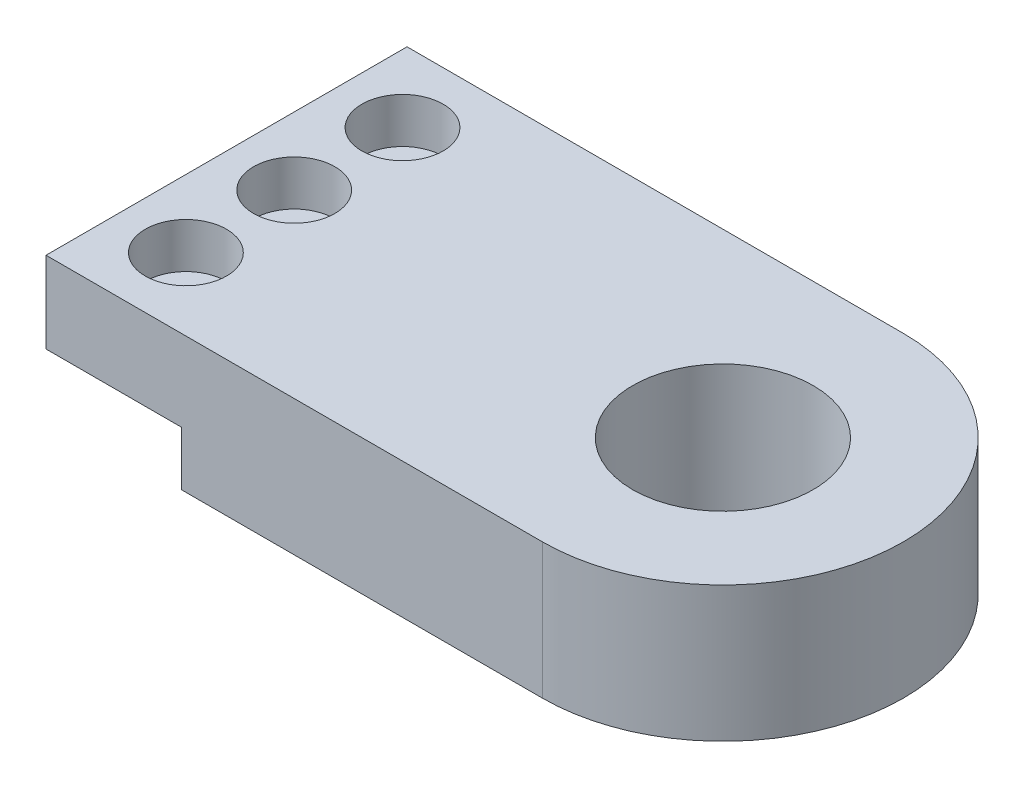
ISO-10303-21;
HEADER;
FILE_DESCRIPTION(('STEP AP214'),'2;1');
FILE_NAME('part.step','',(''),(''),'','','');
FILE_SCHEMA(('AUTOMOTIVE_DESIGN { 1 0 10303 214 1 1 1 1 }'));
ENDSEC;
DATA;
#1=APPLICATION_CONTEXT('core data for automotive mechanical design processes');
#2=APPLICATION_PROTOCOL_DEFINITION('international standard','automotive_design',2000,#1);
#3=PRODUCT_CONTEXT('',#1,'mechanical');
#4=PRODUCT('Part','Part','',(#3));
#5=PRODUCT_RELATED_PRODUCT_CATEGORY('part','',(#4));
#6=PRODUCT_DEFINITION_FORMATION('','',#4);
#7=PRODUCT_DEFINITION_CONTEXT('part definition',#1,'design');
#8=PRODUCT_DEFINITION('design','',#6,#7);
#9=PRODUCT_DEFINITION_SHAPE('','',#8);
#10=(LENGTH_UNIT() NAMED_UNIT(*) SI_UNIT(.MILLI.,.METRE.));
#11=(NAMED_UNIT(*) PLANE_ANGLE_UNIT() SI_UNIT($,.RADIAN.));
#12=(NAMED_UNIT(*) SI_UNIT($,.STERADIAN.) SOLID_ANGLE_UNIT());
#13=UNCERTAINTY_MEASURE_WITH_UNIT(LENGTH_MEASURE(1.E-05),#10,'distance_accuracy_value','');
#14=(GEOMETRIC_REPRESENTATION_CONTEXT(3) GLOBAL_UNCERTAINTY_ASSIGNED_CONTEXT((#13)) GLOBAL_UNIT_ASSIGNED_CONTEXT((#10,
#11,#12)) REPRESENTATION_CONTEXT('',''));
#15=CARTESIAN_POINT('',(0.,0.,0.));
#16=DIRECTION('',(0.,0.,1.));
#17=DIRECTION('',(1.,0.,0.));
#18=AXIS2_PLACEMENT_3D('',#15,#16,#17);
#19=CARTESIAN_POINT('',(-47.4999999999997,-0.000999999999999265,12.));
#20=DIRECTION('',(0.,1.,0.));
#21=DIRECTION('',(0.,0.,1.));
#22=AXIS2_PLACEMENT_3D('',#19,#20,#21);
#23=CYLINDRICAL_SURFACE('',#22,2.5);
#24=CARTESIAN_POINT('',(-47.4999999999997,6.,12.));
#25=DIRECTION('',(0.,-1.,0.));
#26=DIRECTION('',(1.,0.,0.));
#27=AXIS2_PLACEMENT_3D('',#24,#25,#26);
#28=CIRCLE('',#27,2.5);
#29=CARTESIAN_POINT('',(-47.4999999999997,6.,14.5));
#30=VERTEX_POINT('',#29);
#31=EDGE_CURVE('E140',#30,#30,#28,.F.);
#32=CARTESIAN_POINT('',(-47.4999999999997,10.,12.));
#33=DIRECTION('',(0.,1.,0.));
#34=DIRECTION('',(0.,0.,1.));
#35=AXIS2_PLACEMENT_3D('',#32,#33,#34);
#36=CIRCLE('',#35,2.5);
#37=CARTESIAN_POINT('',(-47.4999999999997,10.,14.5));
#38=VERTEX_POINT('',#37);
#39=EDGE_CURVE('E162',#38,#38,#36,.T.);
#40=CARTESIAN_POINT('',(-47.4999999999997,6.,14.5));
#41=CARTESIAN_POINT('',(-47.4999999999997,6.04166666666666,14.5));
#42=CARTESIAN_POINT('',(-47.4999999999997,6.08333333333333,14.5));
#43=CARTESIAN_POINT('',(-47.4999999999997,6.16666666666666,14.5));
#44=CARTESIAN_POINT('',(-47.4999999999997,6.20833333333333,14.5));
#45=CARTESIAN_POINT('',(-47.4999999999997,6.29166666666666,14.5));
#46=CARTESIAN_POINT('',(-47.4999999999997,6.33333333333333,14.5));
#47=CARTESIAN_POINT('',(-47.4999999999997,6.41666666666666,14.5));
#48=CARTESIAN_POINT('',(-47.4999999999997,6.45833333333333,14.5));
#49=CARTESIAN_POINT('',(-47.4999999999997,6.54166666666666,14.5));
#50=CARTESIAN_POINT('',(-47.4999999999997,6.58333333333333,14.5));
#51=CARTESIAN_POINT('',(-47.4999999999997,6.66666666666666,14.5));
#52=CARTESIAN_POINT('',(-47.4999999999997,6.70833333333333,14.5));
#53=CARTESIAN_POINT('',(-47.4999999999997,6.79166666666666,14.5));
#54=CARTESIAN_POINT('',(-47.4999999999997,6.83333333333333,14.5));
#55=CARTESIAN_POINT('',(-47.4999999999997,6.91666666666666,14.5));
#56=CARTESIAN_POINT('',(-47.4999999999997,6.95833333333333,14.5));
#57=CARTESIAN_POINT('',(-47.4999999999997,7.04166666666667,14.5));
#58=CARTESIAN_POINT('',(-47.4999999999997,7.08333333333333,14.5));
#59=CARTESIAN_POINT('',(-47.4999999999997,7.16666666666667,14.5));
#60=CARTESIAN_POINT('',(-47.4999999999997,7.20833333333333,14.5));
#61=CARTESIAN_POINT('',(-47.4999999999997,7.29166666666667,14.5));
#62=CARTESIAN_POINT('',(-47.4999999999997,7.33333333333333,14.5));
#63=CARTESIAN_POINT('',(-47.4999999999997,7.41666666666666,14.5));
#64=CARTESIAN_POINT('',(-47.4999999999997,7.45833333333333,14.5));
#65=CARTESIAN_POINT('',(-47.4999999999997,7.54166666666666,14.5));
#66=CARTESIAN_POINT('',(-47.4999999999997,7.58333333333333,14.5));
#67=CARTESIAN_POINT('',(-47.4999999999997,7.66666666666666,14.5));
#68=CARTESIAN_POINT('',(-47.4999999999997,7.70833333333333,14.5));
#69=CARTESIAN_POINT('',(-47.4999999999997,7.79166666666666,14.5));
#70=CARTESIAN_POINT('',(-47.4999999999997,7.83333333333333,14.5));
#71=CARTESIAN_POINT('',(-47.4999999999997,7.91666666666666,14.5));
#72=CARTESIAN_POINT('',(-47.4999999999997,7.95833333333333,14.5));
#73=CARTESIAN_POINT('',(-47.4999999999997,8.04166666666666,14.5));
#74=CARTESIAN_POINT('',(-47.4999999999997,8.08333333333333,14.5));
#75=CARTESIAN_POINT('',(-47.4999999999997,8.16666666666666,14.5));
#76=CARTESIAN_POINT('',(-47.4999999999997,8.20833333333333,14.5));
#77=CARTESIAN_POINT('',(-47.4999999999997,8.29166666666666,14.5));
#78=CARTESIAN_POINT('',(-47.4999999999997,8.33333333333333,14.5));
#79=CARTESIAN_POINT('',(-47.4999999999997,8.41666666666666,14.5));
#80=CARTESIAN_POINT('',(-47.4999999999997,8.45833333333333,14.5));
#81=CARTESIAN_POINT('',(-47.4999999999997,8.54166666666666,14.5));
#82=CARTESIAN_POINT('',(-47.4999999999997,8.58333333333333,14.5));
#83=CARTESIAN_POINT('',(-47.4999999999997,8.66666666666666,14.5));
#84=CARTESIAN_POINT('',(-47.4999999999997,8.70833333333333,14.5));
#85=CARTESIAN_POINT('',(-47.4999999999997,8.79166666666666,14.5));
#86=CARTESIAN_POINT('',(-47.4999999999997,8.83333333333333,14.5));
#87=CARTESIAN_POINT('',(-47.4999999999997,8.91666666666666,14.5));
#88=CARTESIAN_POINT('',(-47.4999999999997,8.95833333333333,14.5));
#89=CARTESIAN_POINT('',(-47.4999999999997,9.04166666666666,14.5));
#90=CARTESIAN_POINT('',(-47.4999999999997,9.08333333333333,14.5));
#91=CARTESIAN_POINT('',(-47.4999999999997,9.16666666666666,14.5));
#92=CARTESIAN_POINT('',(-47.4999999999997,9.20833333333333,14.5));
#93=CARTESIAN_POINT('',(-47.4999999999997,9.29166666666666,14.5));
#94=CARTESIAN_POINT('',(-47.4999999999997,9.33333333333333,14.5));
#95=CARTESIAN_POINT('',(-47.4999999999997,9.41666666666667,14.5));
#96=CARTESIAN_POINT('',(-47.4999999999997,9.45833333333333,14.5));
#97=CARTESIAN_POINT('',(-47.4999999999997,9.54166666666667,14.5));
#98=CARTESIAN_POINT('',(-47.4999999999997,9.58333333333333,14.5));
#99=CARTESIAN_POINT('',(-47.4999999999997,9.66666666666667,14.5));
#100=CARTESIAN_POINT('',(-47.4999999999997,9.70833333333333,14.5));
#101=CARTESIAN_POINT('',(-47.4999999999997,9.79166666666667,14.5));
#102=CARTESIAN_POINT('',(-47.4999999999997,9.83333333333333,14.5));
#103=CARTESIAN_POINT('',(-47.4999999999997,9.91666666666667,14.5));
#104=CARTESIAN_POINT('',(-47.4999999999997,9.95833333333333,14.5));
#105=CARTESIAN_POINT('',(-47.4999999999997,10.,14.5));
#106=B_SPLINE_CURVE_WITH_KNOTS('',3,(#40,#41,#42,#43,#44,#45,#46,#47,#48,#49,#50,#51,#52,#53,
#54,#55,#56,#57,#58,#59,#60,#61,#62,#63,#64,#65,#66,#67,#68,#69,#70,#71,#72,#73,#74,#75,#76,#77,
#78,#79,#80,#81,#82,#83,#84,#85,#86,#87,#88,#89,#90,#91,#92,#93,#94,#95,#96,#97,#98,#99,#100,
#101,#102,#103,#104,#105),.UNSPECIFIED.,.F.,.F.,(4,2,2,2,2,2,2,2,2,2,2,2,2,2,2,2,2,2,2,2,2,2,2,
2,2,2,2,2,2,2,2,2,4),(0.,0.125,0.25,0.375,0.5,0.625000000000001,0.750000000000001,
0.875000000000001,1.,1.125,1.25,1.375,1.5,1.625,1.75,1.875,2.,2.125,2.25,2.375,2.5,2.625,2.75,
2.875,3.,3.125,3.25,3.375,3.5,3.625,3.75,3.875,4.),.UNSPECIFIED.);
#107=EDGE_CURVE('BSEAM32',#30,#38,#106,.T.);
#108=ORIENTED_EDGE('',*,*,#31,.F.);
#109=ORIENTED_EDGE('',*,*,#39,.T.);
#110=ORIENTED_EDGE('',*,*,#107,.T.);
#111=ORIENTED_EDGE('',*,*,#107,.F.);
#112=EDGE_LOOP('',(#108,#110,#109,#111));
#113=FACE_BOUND('',#112,.T.);
#114=ADVANCED_FACE('F32',(#113),#23,.F.);
#115=CARTESIAN_POINT('',(-47.4999999999999,-0.000999999999999265,0.));
#116=DIRECTION('',(0.,1.,0.));
#117=DIRECTION('',(0.,0.,1.));
#118=AXIS2_PLACEMENT_3D('',#115,#116,#117);
#119=CYLINDRICAL_SURFACE('',#118,2.5);
#120=CARTESIAN_POINT('',(-47.4999999999999,6.,0.));
#121=DIRECTION('',(0.,-1.,0.));
#122=DIRECTION('',(1.,0.,0.));
#123=AXIS2_PLACEMENT_3D('',#120,#121,#122);
#124=CIRCLE('',#123,2.5);
#125=CARTESIAN_POINT('',(-47.4999999999999,6.,2.5));
#126=VERTEX_POINT('',#125);
#127=EDGE_CURVE('E143',#126,#126,#124,.F.);
#128=CARTESIAN_POINT('',(-47.4999999999999,10.,0.));
#129=DIRECTION('',(0.,1.,0.));
#130=DIRECTION('',(0.,0.,1.));
#131=AXIS2_PLACEMENT_3D('',#128,#129,#130);
#132=CIRCLE('',#131,2.5);
#133=CARTESIAN_POINT('',(-47.4999999999999,10.,2.5));
#134=VERTEX_POINT('',#133);
#135=EDGE_CURVE('E152',#134,#134,#132,.T.);
#136=CARTESIAN_POINT('',(-47.4999999999999,6.,2.5));
#137=CARTESIAN_POINT('',(-47.4999999999999,6.04166666666666,2.5));
#138=CARTESIAN_POINT('',(-47.4999999999999,6.08333333333333,2.5));
#139=CARTESIAN_POINT('',(-47.4999999999999,6.16666666666666,2.5));
#140=CARTESIAN_POINT('',(-47.4999999999999,6.20833333333333,2.5));
#141=CARTESIAN_POINT('',(-47.4999999999999,6.29166666666666,2.5));
#142=CARTESIAN_POINT('',(-47.4999999999999,6.33333333333333,2.5));
#143=CARTESIAN_POINT('',(-47.4999999999999,6.41666666666666,2.5));
#144=CARTESIAN_POINT('',(-47.4999999999999,6.45833333333333,2.5));
#145=CARTESIAN_POINT('',(-47.4999999999999,6.54166666666666,2.5));
#146=CARTESIAN_POINT('',(-47.4999999999999,6.58333333333333,2.5));
#147=CARTESIAN_POINT('',(-47.4999999999999,6.66666666666666,2.5));
#148=CARTESIAN_POINT('',(-47.4999999999999,6.70833333333333,2.5));
#149=CARTESIAN_POINT('',(-47.4999999999999,6.79166666666666,2.5));
#150=CARTESIAN_POINT('',(-47.4999999999999,6.83333333333333,2.5));
#151=CARTESIAN_POINT('',(-47.4999999999999,6.91666666666666,2.5));
#152=CARTESIAN_POINT('',(-47.4999999999999,6.95833333333333,2.5));
#153=CARTESIAN_POINT('',(-47.4999999999999,7.04166666666667,2.5));
#154=CARTESIAN_POINT('',(-47.4999999999999,7.08333333333333,2.5));
#155=CARTESIAN_POINT('',(-47.4999999999999,7.16666666666667,2.5));
#156=CARTESIAN_POINT('',(-47.4999999999999,7.20833333333333,2.5));
#157=CARTESIAN_POINT('',(-47.4999999999999,7.29166666666667,2.5));
#158=CARTESIAN_POINT('',(-47.4999999999999,7.33333333333333,2.5));
#159=CARTESIAN_POINT('',(-47.4999999999999,7.41666666666666,2.5));
#160=CARTESIAN_POINT('',(-47.4999999999999,7.45833333333333,2.5));
#161=CARTESIAN_POINT('',(-47.4999999999999,7.54166666666666,2.5));
#162=CARTESIAN_POINT('',(-47.4999999999999,7.58333333333333,2.5));
#163=CARTESIAN_POINT('',(-47.4999999999999,7.66666666666666,2.5));
#164=CARTESIAN_POINT('',(-47.4999999999999,7.70833333333333,2.5));
#165=CARTESIAN_POINT('',(-47.4999999999999,7.79166666666666,2.5));
#166=CARTESIAN_POINT('',(-47.4999999999999,7.83333333333333,2.5));
#167=CARTESIAN_POINT('',(-47.4999999999999,7.91666666666666,2.5));
#168=CARTESIAN_POINT('',(-47.4999999999999,7.95833333333333,2.5));
#169=CARTESIAN_POINT('',(-47.4999999999999,8.04166666666666,2.5));
#170=CARTESIAN_POINT('',(-47.4999999999999,8.08333333333333,2.5));
#171=CARTESIAN_POINT('',(-47.4999999999999,8.16666666666666,2.5));
#172=CARTESIAN_POINT('',(-47.4999999999999,8.20833333333333,2.5));
#173=CARTESIAN_POINT('',(-47.4999999999999,8.29166666666666,2.5));
#174=CARTESIAN_POINT('',(-47.4999999999999,8.33333333333333,2.5));
#175=CARTESIAN_POINT('',(-47.4999999999999,8.41666666666666,2.5));
#176=CARTESIAN_POINT('',(-47.4999999999999,8.45833333333333,2.5));
#177=CARTESIAN_POINT('',(-47.4999999999999,8.54166666666666,2.5));
#178=CARTESIAN_POINT('',(-47.4999999999999,8.58333333333333,2.5));
#179=CARTESIAN_POINT('',(-47.4999999999999,8.66666666666666,2.5));
#180=CARTESIAN_POINT('',(-47.4999999999999,8.70833333333333,2.5));
#181=CARTESIAN_POINT('',(-47.4999999999999,8.79166666666666,2.5));
#182=CARTESIAN_POINT('',(-47.4999999999999,8.83333333333333,2.5));
#183=CARTESIAN_POINT('',(-47.4999999999999,8.91666666666666,2.5));
#184=CARTESIAN_POINT('',(-47.4999999999999,8.95833333333333,2.5));
#185=CARTESIAN_POINT('',(-47.4999999999999,9.04166666666666,2.5));
#186=CARTESIAN_POINT('',(-47.4999999999999,9.08333333333333,2.5));
#187=CARTESIAN_POINT('',(-47.4999999999999,9.16666666666666,2.5));
#188=CARTESIAN_POINT('',(-47.4999999999999,9.20833333333333,2.5));
#189=CARTESIAN_POINT('',(-47.4999999999999,9.29166666666666,2.5));
#190=CARTESIAN_POINT('',(-47.4999999999999,9.33333333333333,2.5));
#191=CARTESIAN_POINT('',(-47.4999999999999,9.41666666666667,2.5));
#192=CARTESIAN_POINT('',(-47.4999999999999,9.45833333333333,2.5));
#193=CARTESIAN_POINT('',(-47.4999999999999,9.54166666666667,2.5));
#194=CARTESIAN_POINT('',(-47.4999999999999,9.58333333333333,2.5));
#195=CARTESIAN_POINT('',(-47.4999999999999,9.66666666666667,2.5));
#196=CARTESIAN_POINT('',(-47.4999999999999,9.70833333333333,2.5));
#197=CARTESIAN_POINT('',(-47.4999999999999,9.79166666666667,2.5));
#198=CARTESIAN_POINT('',(-47.4999999999999,9.83333333333333,2.5));
#199=CARTESIAN_POINT('',(-47.4999999999999,9.91666666666667,2.5));
#200=CARTESIAN_POINT('',(-47.4999999999999,9.95833333333333,2.5));
#201=CARTESIAN_POINT('',(-47.4999999999999,10.,2.5));
#202=B_SPLINE_CURVE_WITH_KNOTS('',3,(#136,#137,#138,#139,#140,#141,#142,#143,#144,#145,#146,
#147,#148,#149,#150,#151,#152,#153,#154,#155,#156,#157,#158,#159,#160,#161,#162,#163,#164,#165,
#166,#167,#168,#169,#170,#171,#172,#173,#174,#175,#176,#177,#178,#179,#180,#181,#182,#183,#184,
#185,#186,#187,#188,#189,#190,#191,#192,#193,#194,#195,#196,#197,#198,#199,#200,#201),
.UNSPECIFIED.,.F.,.F.,(4,2,2,2,2,2,2,2,2,2,2,2,2,2,2,2,2,2,2,2,2,2,2,2,2,2,2,2,2,2,2,2,4),(0.,
0.125,0.25,0.375,0.5,0.625000000000001,0.750000000000001,0.875000000000001,1.,1.125,1.25,1.375,
1.5,1.625,1.75,1.875,2.,2.125,2.25,2.375,2.5,2.625,2.75,2.875,3.,3.125,3.25,3.375,3.5,3.625,
3.75,3.875,4.),.UNSPECIFIED.);
#203=EDGE_CURVE('BSEAM211',#126,#134,#202,.T.);
#204=ORIENTED_EDGE('',*,*,#127,.F.);
#205=ORIENTED_EDGE('',*,*,#135,.T.);
#206=ORIENTED_EDGE('',*,*,#203,.T.);
#207=ORIENTED_EDGE('',*,*,#203,.F.);
#208=EDGE_LOOP('',(#204,#206,#205,#207));
#209=FACE_BOUND('',#208,.T.);
#210=ADVANCED_FACE('F211',(#209),#119,.F.);
#211=CARTESIAN_POINT('',(-47.5,-0.000999999999999265,-12.));
#212=DIRECTION('',(0.,1.,0.));
#213=DIRECTION('',(0.,0.,1.));
#214=AXIS2_PLACEMENT_3D('',#211,#212,#213);
#215=CYLINDRICAL_SURFACE('',#214,2.5);
#216=CARTESIAN_POINT('',(-47.5,6.,-12.));
#217=DIRECTION('',(0.,-1.,0.));
#218=DIRECTION('',(1.,0.,0.));
#219=AXIS2_PLACEMENT_3D('',#216,#217,#218);
#220=CIRCLE('',#219,2.5);
#221=CARTESIAN_POINT('',(-47.5,6.,-9.5));
#222=VERTEX_POINT('',#221);
#223=EDGE_CURVE('E137',#222,#222,#220,.F.);
#224=CARTESIAN_POINT('',(-47.5,10.,-12.));
#225=DIRECTION('',(0.,1.,0.));
#226=DIRECTION('',(0.,0.,1.));
#227=AXIS2_PLACEMENT_3D('',#224,#225,#226);
#228=CIRCLE('',#227,2.5);
#229=CARTESIAN_POINT('',(-47.5,10.,-9.5));
#230=VERTEX_POINT('',#229);
#231=EDGE_CURVE('E165',#230,#230,#228,.T.);
#232=CARTESIAN_POINT('',(-47.5,6.,-9.5));
#233=CARTESIAN_POINT('',(-47.5,6.04166666666666,-9.5));
#234=CARTESIAN_POINT('',(-47.5,6.08333333333333,-9.5));
#235=CARTESIAN_POINT('',(-47.5,6.16666666666666,-9.5));
#236=CARTESIAN_POINT('',(-47.5,6.20833333333333,-9.5));
#237=CARTESIAN_POINT('',(-47.5,6.29166666666666,-9.5));
#238=CARTESIAN_POINT('',(-47.5,6.33333333333333,-9.5));
#239=CARTESIAN_POINT('',(-47.5,6.41666666666666,-9.5));
#240=CARTESIAN_POINT('',(-47.5,6.45833333333333,-9.5));
#241=CARTESIAN_POINT('',(-47.5,6.54166666666666,-9.5));
#242=CARTESIAN_POINT('',(-47.5,6.58333333333333,-9.5));
#243=CARTESIAN_POINT('',(-47.5,6.66666666666666,-9.5));
#244=CARTESIAN_POINT('',(-47.5,6.70833333333333,-9.5));
#245=CARTESIAN_POINT('',(-47.5,6.79166666666666,-9.5));
#246=CARTESIAN_POINT('',(-47.5,6.83333333333333,-9.5));
#247=CARTESIAN_POINT('',(-47.5,6.91666666666666,-9.5));
#248=CARTESIAN_POINT('',(-47.5,6.95833333333333,-9.5));
#249=CARTESIAN_POINT('',(-47.5,7.04166666666667,-9.5));
#250=CARTESIAN_POINT('',(-47.5,7.08333333333333,-9.5));
#251=CARTESIAN_POINT('',(-47.5,7.16666666666667,-9.5));
#252=CARTESIAN_POINT('',(-47.5,7.20833333333333,-9.5));
#253=CARTESIAN_POINT('',(-47.5,7.29166666666667,-9.5));
#254=CARTESIAN_POINT('',(-47.5,7.33333333333333,-9.5));
#255=CARTESIAN_POINT('',(-47.5,7.41666666666666,-9.5));
#256=CARTESIAN_POINT('',(-47.5,7.45833333333333,-9.5));
#257=CARTESIAN_POINT('',(-47.5,7.54166666666666,-9.5));
#258=CARTESIAN_POINT('',(-47.5,7.58333333333333,-9.5));
#259=CARTESIAN_POINT('',(-47.5,7.66666666666666,-9.5));
#260=CARTESIAN_POINT('',(-47.5,7.70833333333333,-9.5));
#261=CARTESIAN_POINT('',(-47.5,7.79166666666666,-9.5));
#262=CARTESIAN_POINT('',(-47.5,7.83333333333333,-9.5));
#263=CARTESIAN_POINT('',(-47.5,7.91666666666666,-9.5));
#264=CARTESIAN_POINT('',(-47.5,7.95833333333333,-9.5));
#265=CARTESIAN_POINT('',(-47.5,8.04166666666666,-9.5));
#266=CARTESIAN_POINT('',(-47.5,8.08333333333333,-9.5));
#267=CARTESIAN_POINT('',(-47.5,8.16666666666666,-9.5));
#268=CARTESIAN_POINT('',(-47.5,8.20833333333333,-9.5));
#269=CARTESIAN_POINT('',(-47.5,8.29166666666666,-9.5));
#270=CARTESIAN_POINT('',(-47.5,8.33333333333333,-9.5));
#271=CARTESIAN_POINT('',(-47.5,8.41666666666666,-9.5));
#272=CARTESIAN_POINT('',(-47.5,8.45833333333333,-9.5));
#273=CARTESIAN_POINT('',(-47.5,8.54166666666666,-9.5));
#274=CARTESIAN_POINT('',(-47.5,8.58333333333333,-9.5));
#275=CARTESIAN_POINT('',(-47.5,8.66666666666666,-9.5));
#276=CARTESIAN_POINT('',(-47.5,8.70833333333333,-9.5));
#277=CARTESIAN_POINT('',(-47.5,8.79166666666666,-9.5));
#278=CARTESIAN_POINT('',(-47.5,8.83333333333333,-9.5));
#279=CARTESIAN_POINT('',(-47.5,8.91666666666666,-9.5));
#280=CARTESIAN_POINT('',(-47.5,8.95833333333333,-9.5));
#281=CARTESIAN_POINT('',(-47.5,9.04166666666666,-9.5));
#282=CARTESIAN_POINT('',(-47.5,9.08333333333333,-9.5));
#283=CARTESIAN_POINT('',(-47.5,9.16666666666666,-9.5));
#284=CARTESIAN_POINT('',(-47.5,9.20833333333333,-9.5));
#285=CARTESIAN_POINT('',(-47.5,9.29166666666666,-9.5));
#286=CARTESIAN_POINT('',(-47.5,9.33333333333333,-9.5));
#287=CARTESIAN_POINT('',(-47.5,9.41666666666667,-9.5));
#288=CARTESIAN_POINT('',(-47.5,9.45833333333333,-9.5));
#289=CARTESIAN_POINT('',(-47.5,9.54166666666667,-9.5));
#290=CARTESIAN_POINT('',(-47.5,9.58333333333333,-9.5));
#291=CARTESIAN_POINT('',(-47.5,9.66666666666667,-9.5));
#292=CARTESIAN_POINT('',(-47.5,9.70833333333333,-9.5));
#293=CARTESIAN_POINT('',(-47.5,9.79166666666667,-9.5));
#294=CARTESIAN_POINT('',(-47.5,9.83333333333333,-9.5));
#295=CARTESIAN_POINT('',(-47.5,9.91666666666667,-9.5));
#296=CARTESIAN_POINT('',(-47.5,9.95833333333333,-9.5));
#297=CARTESIAN_POINT('',(-47.5,10.,-9.5));
#298=B_SPLINE_CURVE_WITH_KNOTS('',3,(#232,#233,#234,#235,#236,#237,#238,#239,#240,#241,#242,
#243,#244,#245,#246,#247,#248,#249,#250,#251,#252,#253,#254,#255,#256,#257,#258,#259,#260,#261,
#262,#263,#264,#265,#266,#267,#268,#269,#270,#271,#272,#273,#274,#275,#276,#277,#278,#279,#280,
#281,#282,#283,#284,#285,#286,#287,#288,#289,#290,#291,#292,#293,#294,#295,#296,#297),
.UNSPECIFIED.,.F.,.F.,(4,2,2,2,2,2,2,2,2,2,2,2,2,2,2,2,2,2,2,2,2,2,2,2,2,2,2,2,2,2,2,2,4),(0.,
0.125,0.25,0.375,0.5,0.625000000000001,0.750000000000001,0.875000000000001,1.,1.125,1.25,1.375,
1.5,1.625,1.75,1.875,2.,2.125,2.25,2.375,2.5,2.625,2.75,2.875,3.,3.125,3.25,3.375,3.5,3.625,
3.75,3.875,4.),.UNSPECIFIED.);
#299=EDGE_CURVE('BSEAM176',#222,#230,#298,.T.);
#300=ORIENTED_EDGE('',*,*,#223,.F.);
#301=ORIENTED_EDGE('',*,*,#231,.T.);
#302=ORIENTED_EDGE('',*,*,#299,.T.);
#303=ORIENTED_EDGE('',*,*,#299,.F.);
#304=EDGE_LOOP('',(#300,#302,#301,#303));
#305=FACE_BOUND('',#304,.T.);
#306=ADVANCED_FACE('F176',(#305),#215,.F.);
#307=CARTESIAN_POINT('',(-40.,15.,-20.));
#308=DIRECTION('',(1.,0.,0.));
#309=DIRECTION('',(0.,0.,-1.));
#310=AXIS2_PLACEMENT_3D('',#307,#308,#309);
#311=PLANE('',#310);
#312=DIRECTION('',(0.,0.,1.));
#313=VECTOR('',#312,1.);
#314=CARTESIAN_POINT('',(-40.,6.,-37.4928556845359));
#315=LINE('',#314,#313);
#316=CARTESIAN_POINT('',(-40.,6.,-20.));
#317=VERTEX_POINT('',#316);
#318=CARTESIAN_POINT('',(-40.,6.,20.));
#319=VERTEX_POINT('',#318);
#320=EDGE_CURVE('E47',#317,#319,#315,.T.);
#321=ORIENTED_EDGE('',*,*,#320,.F.);
#322=DIRECTION('',(0.,-1.,0.));
#323=VECTOR('',#322,1.);
#324=CARTESIAN_POINT('',(-40.,15.,-20.));
#325=LINE('',#324,#323);
#326=CARTESIAN_POINT('',(-40.,0.,-20.));
#327=VERTEX_POINT('',#326);
#328=EDGE_CURVE('E40',#317,#327,#325,.T.);
#329=ORIENTED_EDGE('',*,*,#328,.T.);
#330=DIRECTION('',(0.,0.,1.));
#331=VECTOR('',#330,1.);
#332=CARTESIAN_POINT('',(-40.,0.,-20.));
#333=LINE('',#332,#331);
#334=CARTESIAN_POINT('',(-40.,0.,20.));
#335=VERTEX_POINT('',#334);
#336=EDGE_CURVE('E86',#327,#335,#333,.T.);
#337=ORIENTED_EDGE('',*,*,#336,.T.);
#338=DIRECTION('',(0.,-1.,0.));
#339=VECTOR('',#338,1.);
#340=CARTESIAN_POINT('',(-40.,15.,20.));
#341=LINE('',#340,#339);
#342=EDGE_CURVE('E80',#319,#335,#341,.T.);
#343=ORIENTED_EDGE('',*,*,#342,.F.);
#344=EDGE_LOOP('',(#321,#329,#337,#343));
#345=FACE_BOUND('',#344,.T.);
#346=ADVANCED_FACE('F107',(#345),#311,.F.);
#347=CARTESIAN_POINT('',(0.,15.,0.));
#348=DIRECTION('',(0.,-1.,0.));
#349=DIRECTION('',(0.,0.,-1.));
#350=AXIS2_PLACEMENT_3D('',#347,#348,#349);
#351=PLANE('',#350);
#352=CARTESIAN_POINT('',(-47.4999999999997,15.,12.));
#353=DIRECTION('',(0.,1.,0.));
#354=DIRECTION('',(0.,0.,1.));
#355=AXIS2_PLACEMENT_3D('',#352,#353,#354);
#356=CIRCLE('',#355,4.5);
#357=CARTESIAN_POINT('',(-47.4999999999997,15.,16.5));
#358=VERTEX_POINT('',#357);
#359=EDGE_CURVE('E158',#358,#358,#356,.T.);
#360=ORIENTED_EDGE('',*,*,#359,.F.);
#361=EDGE_LOOP('',(#360));
#362=FACE_BOUND('',#361,.T.);
#363=CARTESIAN_POINT('',(-47.5,15.,-12.));
#364=DIRECTION('',(0.,1.,0.));
#365=DIRECTION('',(0.,0.,1.));
#366=AXIS2_PLACEMENT_3D('',#363,#364,#365);
#367=CIRCLE('',#366,4.5);
#368=CARTESIAN_POINT('',(-47.5,15.,-7.5));
#369=VERTEX_POINT('',#368);
#370=EDGE_CURVE('E168',#369,#369,#367,.T.);
#371=ORIENTED_EDGE('',*,*,#370,.F.);
#372=EDGE_LOOP('',(#371));
#373=FACE_BOUND('',#372,.T.);
#374=CARTESIAN_POINT('',(-47.4999999999999,15.,0.));
#375=DIRECTION('',(0.,1.,0.));
#376=DIRECTION('',(0.,0.,1.));
#377=AXIS2_PLACEMENT_3D('',#374,#375,#376);
#378=CIRCLE('',#377,4.5);
#379=CARTESIAN_POINT('',(-47.4999999999999,15.,4.5));
#380=VERTEX_POINT('',#379);
#381=EDGE_CURVE('E149',#380,#380,#378,.T.);
#382=ORIENTED_EDGE('',*,*,#381,.F.);
#383=EDGE_LOOP('',(#382));
#384=FACE_BOUND('',#383,.T.);
#385=CARTESIAN_POINT('',(0.,15.,0.));
#386=DIRECTION('',(0.,1.,0.));
#387=DIRECTION('',(0.,0.,-1.));
#388=AXIS2_PLACEMENT_3D('',#385,#386,#387);
#389=CIRCLE('',#388,20.);
#390=CARTESIAN_POINT('',(0.,15.,20.));
#391=VERTEX_POINT('',#390);
#392=CARTESIAN_POINT('',(0.,15.,-20.));
#393=VERTEX_POINT('',#392);
#394=EDGE_CURVE('E85',#391,#393,#389,.T.);
#395=ORIENTED_EDGE('',*,*,#394,.T.);
#396=DIRECTION('',(-1.,0.,0.));
#397=VECTOR('',#396,1.);
#398=CARTESIAN_POINT('',(0.,15.,-20.));
#399=LINE('',#398,#397);
#400=CARTESIAN_POINT('',(-55.,15.,-20.));
#401=VERTEX_POINT('',#400);
#402=EDGE_CURVE('E114',#393,#401,#399,.T.);
#403=ORIENTED_EDGE('',*,*,#402,.T.);
#404=DIRECTION('',(0.,0.,1.));
#405=VECTOR('',#404,1.);
#406=CARTESIAN_POINT('',(-55.,15.,-37.4928556845359));
#407=LINE('',#406,#405);
#408=CARTESIAN_POINT('',(-55.,15.,20.));
#409=VERTEX_POINT('',#408);
#410=EDGE_CURVE('E126',#401,#409,#407,.T.);
#411=ORIENTED_EDGE('',*,*,#410,.T.);
#412=DIRECTION('',(1.,0.,0.));
#413=VECTOR('',#412,1.);
#414=CARTESIAN_POINT('',(0.,15.,20.));
#415=LINE('',#414,#413);
#416=EDGE_CURVE('E56',#409,#391,#415,.T.);
#417=ORIENTED_EDGE('',*,*,#416,.T.);
#418=EDGE_LOOP('',(#395,#403,#411,#417));
#419=FACE_BOUND('',#418,.T.);
#420=CARTESIAN_POINT('',(0.,15.,0.));
#421=DIRECTION('',(0.,1.,0.));
#422=DIRECTION('',(0.,0.,1.));
#423=AXIS2_PLACEMENT_3D('',#420,#421,#422);
#424=CIRCLE('',#423,10.);
#425=CARTESIAN_POINT('',(0.,15.,10.));
#426=VERTEX_POINT('',#425);
#427=EDGE_CURVE('E97',#426,#426,#424,.T.);
#428=ORIENTED_EDGE('',*,*,#427,.F.);
#429=EDGE_LOOP('',(#428));
#430=FACE_BOUND('',#429,.T.);
#431=ADVANCED_FACE('F119',(#362,#373,#384,#419,#430),#351,.F.);
#432=CARTESIAN_POINT('',(0.,0.,0.));
#433=DIRECTION('',(0.,-1.,0.));
#434=DIRECTION('',(0.,0.,-1.));
#435=AXIS2_PLACEMENT_3D('',#432,#433,#434);
#436=PLANE('',#435);
#437=CARTESIAN_POINT('',(0.,0.,0.));
#438=DIRECTION('',(0.,1.,0.));
#439=DIRECTION('',(0.,0.,-1.));
#440=AXIS2_PLACEMENT_3D('',#437,#438,#439);
#441=CIRCLE('',#440,20.);
#442=CARTESIAN_POINT('',(0.,0.,20.));
#443=VERTEX_POINT('',#442);
#444=CARTESIAN_POINT('',(0.,0.,-20.));
#445=VERTEX_POINT('',#444);
#446=EDGE_CURVE('E91',#443,#445,#441,.T.);
#447=ORIENTED_EDGE('',*,*,#446,.F.);
#448=DIRECTION('',(1.,0.,0.));
#449=VECTOR('',#448,1.);
#450=CARTESIAN_POINT('',(0.,0.,20.));
#451=LINE('',#450,#449);
#452=EDGE_CURVE('E74',#335,#443,#451,.T.);
#453=ORIENTED_EDGE('',*,*,#452,.F.);
#454=ORIENTED_EDGE('',*,*,#336,.F.);
#455=DIRECTION('',(-1.,0.,0.));
#456=VECTOR('',#455,1.);
#457=CARTESIAN_POINT('',(0.,0.,-20.));
#458=LINE('',#457,#456);
#459=EDGE_CURVE('E96',#445,#327,#458,.T.);
#460=ORIENTED_EDGE('',*,*,#459,.F.);
#461=EDGE_LOOP('',(#447,#453,#454,#460));
#462=FACE_BOUND('',#461,.T.);
#463=CARTESIAN_POINT('',(0.,0.,0.));
#464=DIRECTION('',(0.,1.,0.));
#465=DIRECTION('',(0.,0.,1.));
#466=AXIS2_PLACEMENT_3D('',#463,#464,#465);
#467=CIRCLE('',#466,10.);
#468=CARTESIAN_POINT('',(0.,0.,10.));
#469=VERTEX_POINT('',#468);
#470=EDGE_CURVE('E101',#469,#469,#467,.T.);
#471=ORIENTED_EDGE('',*,*,#470,.T.);
#472=EDGE_LOOP('',(#471));
#473=FACE_BOUND('',#472,.T.);
#474=ADVANCED_FACE('F93',(#462,#473),#436,.T.);
#475=CARTESIAN_POINT('',(0.,15.,0.));
#476=DIRECTION('',(0.,-1.,0.));
#477=DIRECTION('',(0.,0.,-1.));
#478=AXIS2_PLACEMENT_3D('',#475,#476,#477);
#479=CYLINDRICAL_SURFACE('',#478,20.);
#480=ORIENTED_EDGE('',*,*,#446,.T.);
#481=DIRECTION('',(0.,-1.,0.));
#482=VECTOR('',#481,1.);
#483=CARTESIAN_POINT('',(0.,15.,-20.));
#484=LINE('',#483,#482);
#485=EDGE_CURVE('E11',#393,#445,#484,.T.);
#486=ORIENTED_EDGE('',*,*,#485,.F.);
#487=ORIENTED_EDGE('',*,*,#394,.F.);
#488=DIRECTION('',(0.,-1.,0.));
#489=VECTOR('',#488,1.);
#490=CARTESIAN_POINT('',(0.,15.,20.));
#491=LINE('',#490,#489);
#492=EDGE_CURVE('E77',#391,#443,#491,.T.);
#493=ORIENTED_EDGE('',*,*,#492,.T.);
#494=EDGE_LOOP('',(#480,#486,#487,#493));
#495=FACE_BOUND('',#494,.T.);
#496=ADVANCED_FACE('F34',(#495),#479,.T.);
#497=CARTESIAN_POINT('',(0.,15.,-20.));
#498=DIRECTION('',(0.,0.,1.));
#499=DIRECTION('',(1.,0.,0.));
#500=AXIS2_PLACEMENT_3D('',#497,#498,#499);
#501=PLANE('',#500);
#502=ORIENTED_EDGE('',*,*,#459,.T.);
#503=ORIENTED_EDGE('',*,*,#328,.F.);
#504=DIRECTION('',(-1.,0.,0.));
#505=VECTOR('',#504,1.);
#506=CARTESIAN_POINT('',(-40.,6.,-20.));
#507=LINE('',#506,#505);
#508=CARTESIAN_POINT('',(-55.,6.,-20.));
#509=VERTEX_POINT('',#508);
#510=EDGE_CURVE('E124',#317,#509,#507,.T.);
#511=ORIENTED_EDGE('',*,*,#510,.T.);
#512=DIRECTION('',(0.,1.,0.));
#513=VECTOR('',#512,1.);
#514=CARTESIAN_POINT('',(-55.,15.,-20.));
#515=LINE('',#514,#513);
#516=EDGE_CURVE('E117',#509,#401,#515,.T.);
#517=ORIENTED_EDGE('',*,*,#516,.T.);
#518=ORIENTED_EDGE('',*,*,#402,.F.);
#519=ORIENTED_EDGE('',*,*,#485,.T.);
#520=EDGE_LOOP('',(#502,#503,#511,#517,#518,#519));
#521=FACE_BOUND('',#520,.T.);
#522=ADVANCED_FACE('F111',(#521),#501,.F.);
#523=CARTESIAN_POINT('',(0.,15.,20.));
#524=DIRECTION('',(0.,0.,-1.));
#525=DIRECTION('',(-1.,0.,0.));
#526=AXIS2_PLACEMENT_3D('',#523,#524,#525);
#527=PLANE('',#526);
#528=ORIENTED_EDGE('',*,*,#452,.T.);
#529=ORIENTED_EDGE('',*,*,#492,.F.);
#530=ORIENTED_EDGE('',*,*,#416,.F.);
#531=DIRECTION('',(0.,-1.,0.));
#532=VECTOR('',#531,1.);
#533=CARTESIAN_POINT('',(-55.,15.,20.));
#534=LINE('',#533,#532);
#535=CARTESIAN_POINT('',(-55.,6.,20.));
#536=VERTEX_POINT('',#535);
#537=EDGE_CURVE('E134',#409,#536,#534,.T.);
#538=ORIENTED_EDGE('',*,*,#537,.T.);
#539=DIRECTION('',(1.,0.,0.));
#540=VECTOR('',#539,1.);
#541=CARTESIAN_POINT('',(-40.,6.,20.));
#542=LINE('',#541,#540);
#543=EDGE_CURVE('E129',#536,#319,#542,.T.);
#544=ORIENTED_EDGE('',*,*,#543,.T.);
#545=ORIENTED_EDGE('',*,*,#342,.T.);
#546=EDGE_LOOP('',(#528,#529,#530,#538,#544,#545));
#547=FACE_BOUND('',#546,.T.);
#548=ADVANCED_FACE('F76',(#547),#527,.F.);
#549=CARTESIAN_POINT('',(0.,15.,0.));
#550=DIRECTION('',(0.,-1.,0.));
#551=DIRECTION('',(0.,0.,-1.));
#552=AXIS2_PLACEMENT_3D('',#549,#550,#551);
#553=CYLINDRICAL_SURFACE('',#552,10.);
#554=ORIENTED_EDGE('',*,*,#427,.T.);
#555=EDGE_LOOP('',(#554));
#556=FACE_BOUND('',#555,.T.);
#557=ORIENTED_EDGE('',*,*,#470,.F.);
#558=EDGE_LOOP('',(#557));
#559=FACE_BOUND('',#558,.T.);
#560=ADVANCED_FACE('F225',(#556,#559),#553,.F.);
#561=CARTESIAN_POINT('',(-40.,6.,-37.4928556845359));
#562=DIRECTION('',(0.,-1.,0.));
#563=DIRECTION('',(1.,0.,0.));
#564=AXIS2_PLACEMENT_3D('',#561,#562,#563);
#565=PLANE('',#564);
#566=ORIENTED_EDGE('',*,*,#223,.T.);
#567=EDGE_LOOP('',(#566));
#568=FACE_BOUND('',#567,.T.);
#569=ORIENTED_EDGE('',*,*,#127,.T.);
#570=EDGE_LOOP('',(#569));
#571=FACE_BOUND('',#570,.T.);
#572=ORIENTED_EDGE('',*,*,#31,.T.);
#573=EDGE_LOOP('',(#572));
#574=FACE_BOUND('',#573,.T.);
#575=ORIENTED_EDGE('',*,*,#510,.F.);
#576=ORIENTED_EDGE('',*,*,#320,.T.);
#577=ORIENTED_EDGE('',*,*,#543,.F.);
#578=DIRECTION('',(0.,0.,1.));
#579=VECTOR('',#578,1.);
#580=CARTESIAN_POINT('',(-55.,6.,-37.4928556845359));
#581=LINE('',#580,#579);
#582=EDGE_CURVE('E128',#509,#536,#581,.T.);
#583=ORIENTED_EDGE('',*,*,#582,.F.);
#584=EDGE_LOOP('',(#575,#576,#577,#583));
#585=FACE_BOUND('',#584,.T.);
#586=ADVANCED_FACE('F222',(#568,#571,#574,#585),#565,.T.);
#587=CARTESIAN_POINT('',(-55.,15.,-37.4928556845359));
#588=DIRECTION('',(-1.,0.,0.));
#589=DIRECTION('',(0.,0.,1.));
#590=AXIS2_PLACEMENT_3D('',#587,#588,#589);
#591=PLANE('',#590);
#592=ORIENTED_EDGE('',*,*,#516,.F.);
#593=ORIENTED_EDGE('',*,*,#582,.T.);
#594=ORIENTED_EDGE('',*,*,#537,.F.);
#595=ORIENTED_EDGE('',*,*,#410,.F.);
#596=EDGE_LOOP('',(#592,#593,#594,#595));
#597=FACE_BOUND('',#596,.T.);
#598=ADVANCED_FACE('F188',(#597),#591,.T.);
#599=CARTESIAN_POINT('',(-47.5,10.,-12.));
#600=DIRECTION('',(0.,1.,0.));
#601=DIRECTION('',(0.,0.,1.));
#602=AXIS2_PLACEMENT_3D('',#599,#600,#601);
#603=CYLINDRICAL_SURFACE('',#602,4.5);
#604=CARTESIAN_POINT('',(-47.5,10.,-12.));
#605=DIRECTION('',(0.,1.,0.));
#606=DIRECTION('',(0.,0.,1.));
#607=AXIS2_PLACEMENT_3D('',#604,#605,#606);
#608=CIRCLE('',#607,4.5);
#609=CARTESIAN_POINT('',(-47.5,10.,-7.5));
#610=VERTEX_POINT('',#609);
#611=EDGE_CURVE('E157',#610,#610,#608,.T.);
#612=ORIENTED_EDGE('',*,*,#611,.F.);
#613=EDGE_LOOP('',(#612));
#614=FACE_BOUND('',#613,.T.);
#615=ORIENTED_EDGE('',*,*,#370,.T.);
#616=EDGE_LOOP('',(#615));
#617=FACE_BOUND('',#616,.T.);
#618=ADVANCED_FACE('F182',(#614,#617),#603,.F.);
#619=CARTESIAN_POINT('',(-47.5,10.,-12.));
#620=DIRECTION('',(0.,1.,0.));
#621=DIRECTION('',(0.,0.,1.));
#622=AXIS2_PLACEMENT_3D('',#619,#620,#621);
#623=PLANE('',#622);
#624=ORIENTED_EDGE('',*,*,#231,.F.);
#625=EDGE_LOOP('',(#624));
#626=FACE_BOUND('',#625,.T.);
#627=ORIENTED_EDGE('',*,*,#611,.T.);
#628=EDGE_LOOP('',(#627));
#629=FACE_BOUND('',#628,.T.);
#630=ADVANCED_FACE('F178',(#626,#629),#623,.T.);
#631=CARTESIAN_POINT('',(-47.4999999999999,10.,0.));
#632=DIRECTION('',(0.,1.,0.));
#633=DIRECTION('',(0.,0.,1.));
#634=AXIS2_PLACEMENT_3D('',#631,#632,#633);
#635=CYLINDRICAL_SURFACE('',#634,4.5);
#636=CARTESIAN_POINT('',(-47.4999999999999,10.,0.));
#637=DIRECTION('',(0.,1.,0.));
#638=DIRECTION('',(0.,0.,1.));
#639=AXIS2_PLACEMENT_3D('',#636,#637,#638);
#640=CIRCLE('',#639,4.5);
#641=CARTESIAN_POINT('',(-47.4999999999999,10.,4.5));
#642=VERTEX_POINT('',#641);
#643=EDGE_CURVE('E144',#642,#642,#640,.T.);
#644=ORIENTED_EDGE('',*,*,#643,.F.);
#645=EDGE_LOOP('',(#644));
#646=FACE_BOUND('',#645,.T.);
#647=ORIENTED_EDGE('',*,*,#381,.T.);
#648=EDGE_LOOP('',(#647));
#649=FACE_BOUND('',#648,.T.);
#650=ADVANCED_FACE('F181',(#646,#649),#635,.F.);
#651=CARTESIAN_POINT('',(-47.4999999999999,10.,0.));
#652=DIRECTION('',(0.,1.,0.));
#653=DIRECTION('',(0.,0.,1.));
#654=AXIS2_PLACEMENT_3D('',#651,#652,#653);
#655=PLANE('',#654);
#656=ORIENTED_EDGE('',*,*,#135,.F.);
#657=EDGE_LOOP('',(#656));
#658=FACE_BOUND('',#657,.T.);
#659=ORIENTED_EDGE('',*,*,#643,.T.);
#660=EDGE_LOOP('',(#659));
#661=FACE_BOUND('',#660,.T.);
#662=ADVANCED_FACE('F199',(#658,#661),#655,.T.);
#663=CARTESIAN_POINT('',(-47.4999999999997,10.,12.));
#664=DIRECTION('',(0.,1.,0.));
#665=DIRECTION('',(0.,0.,1.));
#666=AXIS2_PLACEMENT_3D('',#663,#664,#665);
#667=CYLINDRICAL_SURFACE('',#666,4.5);
#668=CARTESIAN_POINT('',(-47.4999999999997,10.,12.));
#669=DIRECTION('',(0.,1.,0.));
#670=DIRECTION('',(0.,0.,1.));
#671=AXIS2_PLACEMENT_3D('',#668,#669,#670);
#672=CIRCLE('',#671,4.5);
#673=CARTESIAN_POINT('',(-47.4999999999997,10.,16.5));
#674=VERTEX_POINT('',#673);
#675=EDGE_CURVE('E161',#674,#674,#672,.T.);
#676=ORIENTED_EDGE('',*,*,#675,.F.);
#677=EDGE_LOOP('',(#676));
#678=FACE_BOUND('',#677,.T.);
#679=ORIENTED_EDGE('',*,*,#359,.T.);
#680=EDGE_LOOP('',(#679));
#681=FACE_BOUND('',#680,.T.);
#682=ADVANCED_FACE('F205',(#678,#681),#667,.F.);
#683=CARTESIAN_POINT('',(-47.4999999999997,10.,12.));
#684=DIRECTION('',(0.,1.,0.));
#685=DIRECTION('',(0.,0.,1.));
#686=AXIS2_PLACEMENT_3D('',#683,#684,#685);
#687=PLANE('',#686);
#688=ORIENTED_EDGE('',*,*,#39,.F.);
#689=EDGE_LOOP('',(#688));
#690=FACE_BOUND('',#689,.T.);
#691=ORIENTED_EDGE('',*,*,#675,.T.);
#692=EDGE_LOOP('',(#691));
#693=FACE_BOUND('',#692,.T.);
#694=ADVANCED_FACE('F344',(#690,#693),#687,.T.);
#695=CLOSED_SHELL('',(#114,#210,#306,#346,#431,#474,#496,#522,#548,#560,#586,#598,#618,#630,
#650,#662,#682,#694));
#696=MANIFOLD_SOLID_BREP('B2',#695);
#697=ADVANCED_BREP_SHAPE_REPRESENTATION('',(#18,#696),#14);
#698=SHAPE_DEFINITION_REPRESENTATION(#9,#697);
ENDSEC;
END-ISO-10303-21;
